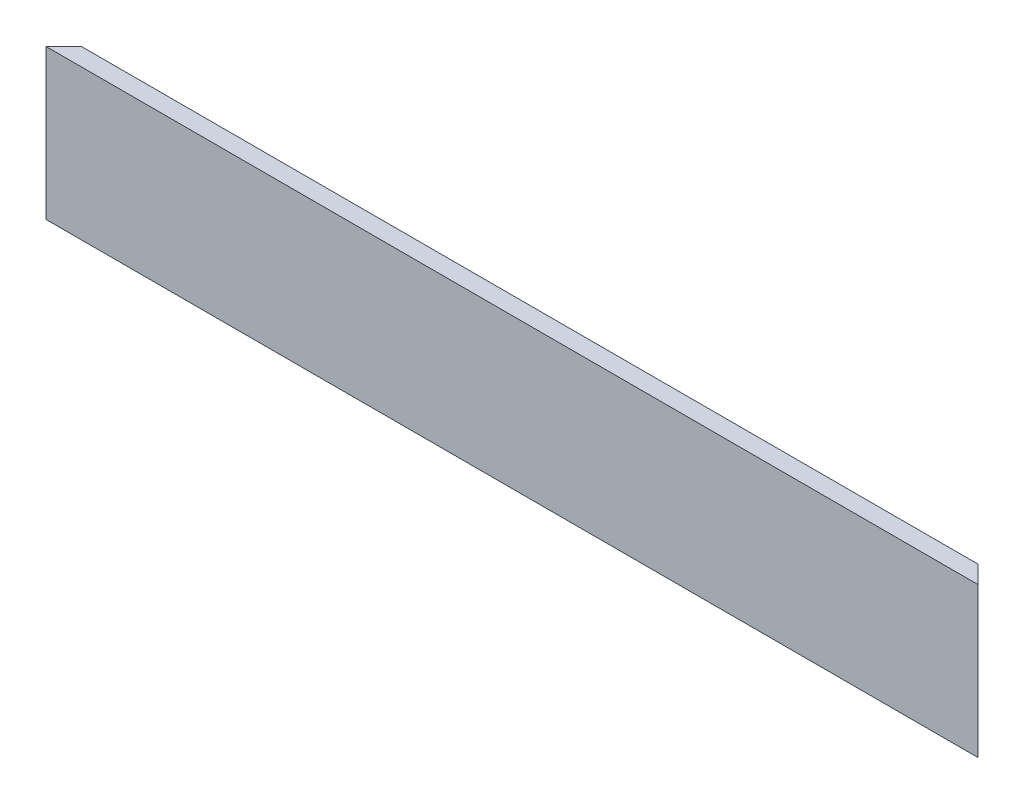
ISO-10303-21;
HEADER;
FILE_DESCRIPTION(('STEP AP214'),'2;1');
FILE_NAME('part.step','',(''),(''),'','','');
FILE_SCHEMA(('AUTOMOTIVE_DESIGN { 1 0 10303 214 1 1 1 1 }'));
ENDSEC;
DATA;
#1=APPLICATION_CONTEXT('core data for automotive mechanical design processes');
#2=APPLICATION_PROTOCOL_DEFINITION('international standard','automotive_design',2000,#1);
#3=PRODUCT_CONTEXT('',#1,'mechanical');
#4=PRODUCT('Part','Part','',(#3));
#5=PRODUCT_RELATED_PRODUCT_CATEGORY('part','',(#4));
#6=PRODUCT_DEFINITION_FORMATION('','',#4);
#7=PRODUCT_DEFINITION_CONTEXT('part definition',#1,'design');
#8=PRODUCT_DEFINITION('design','',#6,#7);
#9=PRODUCT_DEFINITION_SHAPE('','',#8);
#10=(LENGTH_UNIT() NAMED_UNIT(*) SI_UNIT(.MILLI.,.METRE.));
#11=(NAMED_UNIT(*) PLANE_ANGLE_UNIT() SI_UNIT($,.RADIAN.));
#12=(NAMED_UNIT(*) SI_UNIT($,.STERADIAN.) SOLID_ANGLE_UNIT());
#13=UNCERTAINTY_MEASURE_WITH_UNIT(LENGTH_MEASURE(1.E-05),#10,'distance_accuracy_value','');
#14=(GEOMETRIC_REPRESENTATION_CONTEXT(3) GLOBAL_UNCERTAINTY_ASSIGNED_CONTEXT((#13)) GLOBAL_UNIT_ASSIGNED_CONTEXT((#10,
#11,#12)) REPRESENTATION_CONTEXT('',''));
#15=CARTESIAN_POINT('',(0.,0.,0.));
#16=DIRECTION('',(0.,0.,1.));
#17=DIRECTION('',(1.,0.,0.));
#18=AXIS2_PLACEMENT_3D('',#15,#16,#17);
#19=CARTESIAN_POINT('',(158.,6.35,16.8742989565129));
#20=DIRECTION('',(0.,-1.,0.));
#21=DIRECTION('',(0.,0.,-1.));
#22=AXIS2_PLACEMENT_3D('',#19,#20,#21);
#23=PLANE('',#22);
#24=DIRECTION('',(0.707106781186551,0.,0.707106781186544));
#25=VECTOR('',#24,1.);
#26=CARTESIAN_POINT('',(132.6,6.35,-8.52570104348712));
#27=LINE('',#26,#25);
#28=CARTESIAN_POINT('',(155.,6.35,13.8742989565129));
#29=VERTEX_POINT('',#28);
#30=CARTESIAN_POINT('',(158.,6.35,16.8742989565129));
#31=VERTEX_POINT('',#30);
#32=EDGE_CURVE('E93',#29,#31,#27,.T.);
#33=ORIENTED_EDGE('',*,*,#32,.F.);
#34=DIRECTION('',(-1.,0.,0.));
#35=VECTOR('',#34,1.);
#36=CARTESIAN_POINT('',(158.,6.35,13.8742989565129));
#37=LINE('',#36,#35);
#38=CARTESIAN_POINT('',(3.00000000000003,6.35,13.8742989565129));
#39=VERTEX_POINT('',#38);
#40=EDGE_CURVE('E62',#29,#39,#37,.T.);
#41=ORIENTED_EDGE('',*,*,#40,.T.);
#42=DIRECTION('',(0.707106781186551,0.,-0.707106781186544));
#43=VECTOR('',#42,1.);
#44=CARTESIAN_POINT('',(0.,6.35,16.8742989565129));
#45=LINE('',#44,#43);
#46=CARTESIAN_POINT('',(0.,6.35,16.8742989565129));
#47=VERTEX_POINT('',#46);
#48=EDGE_CURVE('E108',#47,#39,#45,.T.);
#49=ORIENTED_EDGE('',*,*,#48,.F.);
#50=DIRECTION('',(-1.,0.,0.));
#51=VECTOR('',#50,1.);
#52=CARTESIAN_POINT('',(158.,6.35,16.8742989565129));
#53=LINE('',#52,#51);
#54=EDGE_CURVE('E102',#31,#47,#53,.T.);
#55=ORIENTED_EDGE('',*,*,#54,.F.);
#56=EDGE_LOOP('',(#33,#41,#49,#55));
#57=FACE_BOUND('',#56,.T.);
#58=ADVANCED_FACE('F41',(#57),#23,.F.);
#59=CARTESIAN_POINT('',(158.,-19.05,-8.52570104348712));
#60=DIRECTION('',(0.,0.,1.));
#61=DIRECTION('',(1.,0.,0.));
#62=AXIS2_PLACEMENT_3D('',#59,#60,#61);
#63=PLANE('',#62);
#64=DIRECTION('',(0.,1.,0.));
#65=VECTOR('',#64,1.);
#66=CARTESIAN_POINT('',(132.6,-98.65,-8.52570104348712));
#67=LINE('',#66,#65);
#68=CARTESIAN_POINT('',(132.6,-19.05,-8.52570104348712));
#69=VERTEX_POINT('',#68);
#70=CARTESIAN_POINT('',(132.6,-16.05,-8.52570104348712));
#71=VERTEX_POINT('',#70);
#72=EDGE_CURVE('E100',#69,#71,#67,.T.);
#73=ORIENTED_EDGE('',*,*,#72,.F.);
#74=DIRECTION('',(-1.,0.,0.));
#75=VECTOR('',#74,1.);
#76=CARTESIAN_POINT('',(158.,-19.05,-8.52570104348712));
#77=LINE('',#76,#75);
#78=CARTESIAN_POINT('',(25.4000000000003,-19.05,-8.52570104348712));
#79=VERTEX_POINT('',#78);
#80=EDGE_CURVE('E115',#69,#79,#77,.T.);
#81=ORIENTED_EDGE('',*,*,#80,.T.);
#82=DIRECTION('',(0.,1.,0.));
#83=VECTOR('',#82,1.);
#84=CARTESIAN_POINT('',(25.4000000000003,-98.65,-8.52570104348712));
#85=LINE('',#84,#83);
#86=CARTESIAN_POINT('',(25.4000000000003,-16.05,-8.52570104348712));
#87=VERTEX_POINT('',#86);
#88=EDGE_CURVE('E126',#79,#87,#85,.T.);
#89=ORIENTED_EDGE('',*,*,#88,.T.);
#90=DIRECTION('',(-1.,0.,0.));
#91=VECTOR('',#90,1.);
#92=CARTESIAN_POINT('',(158.,-16.05,-8.52570104348712));
#93=LINE('',#92,#91);
#94=EDGE_CURVE('E116',#71,#87,#93,.T.);
#95=ORIENTED_EDGE('',*,*,#94,.F.);
#96=EDGE_LOOP('',(#73,#81,#89,#95));
#97=FACE_BOUND('',#96,.T.);
#98=ADVANCED_FACE('F141',(#97),#63,.F.);
#99=CARTESIAN_POINT('',(158.,6.35,16.8742989565129));
#100=DIRECTION('',(0.,0.,-1.));
#101=DIRECTION('',(0.,1.,0.));
#102=AXIS2_PLACEMENT_3D('',#99,#100,#101);
#103=PLANE('',#102);
#104=DIRECTION('',(0.,-1.,0.));
#105=VECTOR('',#104,1.);
#106=CARTESIAN_POINT('',(0.,6.35,16.8742989565129));
#107=LINE('',#106,#105);
#108=CARTESIAN_POINT('',(0.,-19.05,16.8742989565129));
#109=VERTEX_POINT('',#108);
#110=EDGE_CURVE('E110',#47,#109,#107,.T.);
#111=ORIENTED_EDGE('',*,*,#110,.T.);
#112=DIRECTION('',(-1.,0.,0.));
#113=VECTOR('',#112,1.);
#114=CARTESIAN_POINT('',(158.,-19.05,16.8742989565129));
#115=LINE('',#114,#113);
#116=CARTESIAN_POINT('',(158.,-19.05,16.8742989565129));
#117=VERTEX_POINT('',#116);
#118=EDGE_CURVE('E106',#117,#109,#115,.T.);
#119=ORIENTED_EDGE('',*,*,#118,.F.);
#120=DIRECTION('',(0.,-1.,0.));
#121=VECTOR('',#120,1.);
#122=CARTESIAN_POINT('',(158.,6.35,16.8742989565129));
#123=LINE('',#122,#121);
#124=EDGE_CURVE('E94',#31,#117,#123,.T.);
#125=ORIENTED_EDGE('',*,*,#124,.F.);
#126=ORIENTED_EDGE('',*,*,#54,.T.);
#127=EDGE_LOOP('',(#111,#119,#125,#126));
#128=FACE_BOUND('',#127,.T.);
#129=ADVANCED_FACE('F103',(#128),#103,.F.);
#130=CARTESIAN_POINT('',(158.,-19.05,16.8742989565129));
#131=DIRECTION('',(0.,1.,0.));
#132=DIRECTION('',(0.,0.,1.));
#133=AXIS2_PLACEMENT_3D('',#130,#131,#132);
#134=PLANE('',#133);
#135=ORIENTED_EDGE('',*,*,#80,.F.);
#136=DIRECTION('',(0.707106781186551,0.,0.707106781186544));
#137=VECTOR('',#136,1.);
#138=CARTESIAN_POINT('',(158.,-19.05,16.8742989565129));
#139=LINE('',#138,#137);
#140=EDGE_CURVE('E132',#69,#117,#139,.T.);
#141=ORIENTED_EDGE('',*,*,#140,.T.);
#142=ORIENTED_EDGE('',*,*,#118,.T.);
#143=DIRECTION('',(0.707106781186551,0.,-0.707106781186544));
#144=VECTOR('',#143,1.);
#145=CARTESIAN_POINT('',(79.0000000000009,-19.05,-62.1257010434871));
#146=LINE('',#145,#144);
#147=EDGE_CURVE('E123',#109,#79,#146,.T.);
#148=ORIENTED_EDGE('',*,*,#147,.T.);
#149=EDGE_LOOP('',(#135,#141,#142,#148));
#150=FACE_BOUND('',#149,.T.);
#151=ADVANCED_FACE('F149',(#150),#134,.F.);
#152=CARTESIAN_POINT('',(158.,-16.05,-8.52570104348712));
#153=DIRECTION('',(0.,-1.,0.));
#154=DIRECTION('',(0.,0.,-1.));
#155=AXIS2_PLACEMENT_3D('',#152,#153,#154);
#156=PLANE('',#155);
#157=DIRECTION('',(-1.,0.,0.));
#158=VECTOR('',#157,1.);
#159=CARTESIAN_POINT('',(158.,-16.05,13.8742989565129));
#160=LINE('',#159,#158);
#161=CARTESIAN_POINT('',(155.,-16.05,13.8742989565129));
#162=VERTEX_POINT('',#161);
#163=CARTESIAN_POINT('',(3.00000000000003,-16.05,13.8742989565129));
#164=VERTEX_POINT('',#163);
#165=EDGE_CURVE('E119',#162,#164,#160,.T.);
#166=ORIENTED_EDGE('',*,*,#165,.F.);
#167=DIRECTION('',(-0.707106781186551,0.,-0.707106781186544));
#168=VECTOR('',#167,1.);
#169=CARTESIAN_POINT('',(145.3,-16.05,4.17429895651301));
#170=LINE('',#169,#168);
#171=EDGE_CURVE('E54',#162,#71,#170,.T.);
#172=ORIENTED_EDGE('',*,*,#171,.T.);
#173=ORIENTED_EDGE('',*,*,#94,.T.);
#174=DIRECTION('',(-0.707106781186551,0.,0.707106781186544));
#175=VECTOR('',#174,1.);
#176=CARTESIAN_POINT('',(91.7000000000009,-16.05,-74.825701043487));
#177=LINE('',#176,#175);
#178=EDGE_CURVE('E121',#87,#164,#177,.T.);
#179=ORIENTED_EDGE('',*,*,#178,.T.);
#180=EDGE_LOOP('',(#166,#172,#173,#179));
#181=FACE_BOUND('',#180,.T.);
#182=ADVANCED_FACE('F143',(#181),#156,.F.);
#183=CARTESIAN_POINT('',(158.,-16.05,13.8742989565129));
#184=DIRECTION('',(0.,0.,1.));
#185=DIRECTION('',(1.,0.,0.));
#186=AXIS2_PLACEMENT_3D('',#183,#184,#185);
#187=PLANE('',#186);
#188=ORIENTED_EDGE('',*,*,#40,.F.);
#189=DIRECTION('',(0.,-1.,0.));
#190=VECTOR('',#189,1.);
#191=CARTESIAN_POINT('',(155.,-16.05,13.8742989565129));
#192=LINE('',#191,#190);
#193=EDGE_CURVE('E11',#29,#162,#192,.T.);
#194=ORIENTED_EDGE('',*,*,#193,.T.);
#195=ORIENTED_EDGE('',*,*,#165,.T.);
#196=DIRECTION('',(0.,1.,0.));
#197=VECTOR('',#196,1.);
#198=CARTESIAN_POINT('',(3.00000000000003,-16.05,13.8742989565129));
#199=LINE('',#198,#197);
#200=EDGE_CURVE('E48',#164,#39,#199,.T.);
#201=ORIENTED_EDGE('',*,*,#200,.T.);
#202=EDGE_LOOP('',(#188,#194,#195,#201));
#203=FACE_BOUND('',#202,.T.);
#204=ADVANCED_FACE('F156',(#203),#187,.F.);
#205=CARTESIAN_POINT('',(0.,-98.65,16.8742989565129));
#206=DIRECTION('',(0.707106781186544,0.,0.707106781186551));
#207=DIRECTION('',(0.707106781186551,0.,-0.707106781186544));
#208=AXIS2_PLACEMENT_3D('',#205,#206,#207);
#209=PLANE('',#208);
#210=ORIENTED_EDGE('',*,*,#110,.F.);
#211=ORIENTED_EDGE('',*,*,#48,.T.);
#212=ORIENTED_EDGE('',*,*,#200,.F.);
#213=ORIENTED_EDGE('',*,*,#178,.F.);
#214=ORIENTED_EDGE('',*,*,#88,.F.);
#215=ORIENTED_EDGE('',*,*,#147,.F.);
#216=EDGE_LOOP('',(#210,#211,#212,#213,#214,#215));
#217=FACE_BOUND('',#216,.T.);
#218=ADVANCED_FACE('F148',(#217),#209,.F.);
#219=CARTESIAN_POINT('',(132.6,-98.65,-8.52570104348712));
#220=DIRECTION('',(-0.707106781186544,0.,0.707106781186551));
#221=DIRECTION('',(0.707106781186551,0.,0.707106781186544));
#222=AXIS2_PLACEMENT_3D('',#219,#220,#221);
#223=PLANE('',#222);
#224=ORIENTED_EDGE('',*,*,#72,.T.);
#225=ORIENTED_EDGE('',*,*,#171,.F.);
#226=ORIENTED_EDGE('',*,*,#193,.F.);
#227=ORIENTED_EDGE('',*,*,#32,.T.);
#228=ORIENTED_EDGE('',*,*,#124,.T.);
#229=ORIENTED_EDGE('',*,*,#140,.F.);
#230=EDGE_LOOP('',(#224,#225,#226,#227,#228,#229));
#231=FACE_BOUND('',#230,.T.);
#232=ADVANCED_FACE('F91',(#231),#223,.F.);
#233=CLOSED_SHELL('',(#58,#98,#129,#151,#182,#204,#218,#232));
#234=MANIFOLD_SOLID_BREP('B2',#233);
#235=ADVANCED_BREP_SHAPE_REPRESENTATION('',(#18,#234),#14);
#236=SHAPE_DEFINITION_REPRESENTATION(#9,#235);
ENDSEC;
END-ISO-10303-21;
